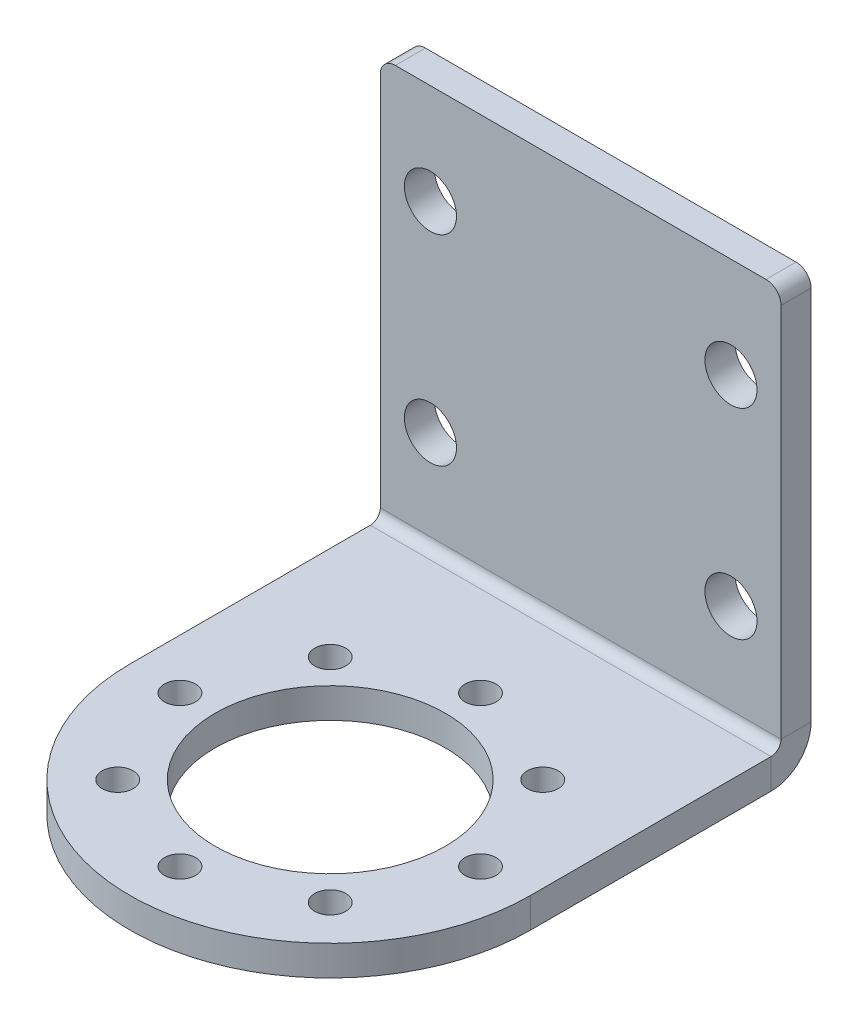
ISO-10303-21;
HEADER;
FILE_DESCRIPTION(('STEP AP214'),'2;1');
FILE_NAME('part.step','',(''),(''),'','','');
FILE_SCHEMA(('AUTOMOTIVE_DESIGN { 1 0 10303 214 1 1 1 1 }'));
ENDSEC;
DATA;
#1=APPLICATION_CONTEXT('core data for automotive mechanical design processes');
#2=APPLICATION_PROTOCOL_DEFINITION('international standard','automotive_design',2000,#1);
#3=PRODUCT_CONTEXT('',#1,'mechanical');
#4=PRODUCT('Part','Part','',(#3));
#5=PRODUCT_RELATED_PRODUCT_CATEGORY('part','',(#4));
#6=PRODUCT_DEFINITION_FORMATION('','',#4);
#7=PRODUCT_DEFINITION_CONTEXT('part definition',#1,'design');
#8=PRODUCT_DEFINITION('design','',#6,#7);
#9=PRODUCT_DEFINITION_SHAPE('','',#8);
#10=(LENGTH_UNIT() NAMED_UNIT(*) SI_UNIT(.MILLI.,.METRE.));
#11=(NAMED_UNIT(*) PLANE_ANGLE_UNIT() SI_UNIT($,.RADIAN.));
#12=(NAMED_UNIT(*) SI_UNIT($,.STERADIAN.) SOLID_ANGLE_UNIT());
#13=UNCERTAINTY_MEASURE_WITH_UNIT(LENGTH_MEASURE(1.E-05),#10,'distance_accuracy_value','');
#14=(GEOMETRIC_REPRESENTATION_CONTEXT(3) GLOBAL_UNCERTAINTY_ASSIGNED_CONTEXT((#13)) GLOBAL_UNIT_ASSIGNED_CONTEXT((#10,
#11,#12)) REPRESENTATION_CONTEXT('',''));
#15=CARTESIAN_POINT('',(0.,0.,0.));
#16=DIRECTION('',(0.,0.,1.));
#17=DIRECTION('',(1.,0.,0.));
#18=AXIS2_PLACEMENT_3D('',#15,#16,#17);
#19=CARTESIAN_POINT('',(-18.5,17.5,0.));
#20=DIRECTION('',(0.,0.,1.));
#21=DIRECTION('',(-0.999999999999933,-3.65500994803371E-07,0.));
#22=AXIS2_PLACEMENT_3D('',#19,#20,#21);
#23=CYLINDRICAL_SURFACE('',#22,1.5);
#24=CARTESIAN_POINT('',(-18.5,17.5,0.));
#25=DIRECTION('',(0.,0.,-1.));
#26=DIRECTION('',(-1.,0.,0.));
#27=AXIS2_PLACEMENT_3D('',#24,#25,#26);
#28=CIRCLE('',#27,1.5);
#29=CARTESIAN_POINT('',(-20.,17.5,0.));
#30=VERTEX_POINT('',#29);
#31=CARTESIAN_POINT('',(-18.5,19.,0.));
#32=VERTEX_POINT('',#31);
#33=EDGE_CURVE('E294',#30,#32,#28,.T.);
#34=ORIENTED_EDGE('',*,*,#33,.F.);
#35=DIRECTION('',(0.,0.,-1.));
#36=VECTOR('',#35,1.);
#37=CARTESIAN_POINT('',(-20.,17.5,3.));
#38=LINE('',#37,#36);
#39=CARTESIAN_POINT('',(-20.,17.5,3.));
#40=VERTEX_POINT('',#39);
#41=EDGE_CURVE('E281',#40,#30,#38,.T.);
#42=ORIENTED_EDGE('',*,*,#41,.F.);
#43=CARTESIAN_POINT('',(-18.5,17.5,3.));
#44=DIRECTION('',(0.,0.,1.));
#45=DIRECTION('',(0.,1.,0.));
#46=AXIS2_PLACEMENT_3D('',#43,#44,#45);
#47=CIRCLE('',#46,1.5);
#48=CARTESIAN_POINT('',(-18.5,19.,3.));
#49=VERTEX_POINT('',#48);
#50=EDGE_CURVE('E318',#49,#40,#47,.T.);
#51=ORIENTED_EDGE('',*,*,#50,.F.);
#52=DIRECTION('',(0.,0.,1.));
#53=VECTOR('',#52,1.);
#54=CARTESIAN_POINT('',(-18.5,19.,0.));
#55=LINE('',#54,#53);
#56=EDGE_CURVE('E312',#32,#49,#55,.T.);
#57=ORIENTED_EDGE('',*,*,#56,.F.);
#58=EDGE_LOOP('',(#34,#42,#51,#57));
#59=FACE_BOUND('',#58,.T.);
#60=ADVANCED_FACE('F17',(#59),#23,.T.);
#61=CARTESIAN_POINT('',(18.5,17.5,0.));
#62=DIRECTION('',(0.,0.,1.));
#63=DIRECTION('',(-3.65500990066421E-07,0.999999999999933,0.));
#64=AXIS2_PLACEMENT_3D('',#61,#62,#63);
#65=CYLINDRICAL_SURFACE('',#64,1.5);
#66=CARTESIAN_POINT('',(18.5,17.5,0.));
#67=DIRECTION('',(0.,0.,-1.));
#68=DIRECTION('',(0.,1.,0.));
#69=AXIS2_PLACEMENT_3D('',#66,#67,#68);
#70=CIRCLE('',#69,1.5);
#71=CARTESIAN_POINT('',(18.5,19.,0.));
#72=VERTEX_POINT('',#71);
#73=CARTESIAN_POINT('',(20.,17.5,0.));
#74=VERTEX_POINT('',#73);
#75=EDGE_CURVE('E266',#72,#74,#70,.T.);
#76=ORIENTED_EDGE('',*,*,#75,.F.);
#77=DIRECTION('',(0.,0.,-1.));
#78=VECTOR('',#77,1.);
#79=CARTESIAN_POINT('',(18.5,19.,3.));
#80=LINE('',#79,#78);
#81=CARTESIAN_POINT('',(18.5,19.,3.));
#82=VERTEX_POINT('',#81);
#83=EDGE_CURVE('E304',#82,#72,#80,.T.);
#84=ORIENTED_EDGE('',*,*,#83,.F.);
#85=CARTESIAN_POINT('',(18.5,17.5,3.));
#86=DIRECTION('',(0.,0.,1.));
#87=DIRECTION('',(1.,0.,0.));
#88=AXIS2_PLACEMENT_3D('',#85,#86,#87);
#89=CIRCLE('',#88,1.5);
#90=CARTESIAN_POINT('',(20.,17.5,3.));
#91=VERTEX_POINT('',#90);
#92=EDGE_CURVE('E432',#91,#82,#89,.T.);
#93=ORIENTED_EDGE('',*,*,#92,.F.);
#94=DIRECTION('',(0.,0.,1.));
#95=VECTOR('',#94,1.);
#96=CARTESIAN_POINT('',(20.,17.5,0.));
#97=LINE('',#96,#95);
#98=EDGE_CURVE('E269',#74,#91,#97,.T.);
#99=ORIENTED_EDGE('',*,*,#98,.F.);
#100=EDGE_LOOP('',(#76,#84,#93,#99));
#101=FACE_BOUND('',#100,.T.);
#102=ADVANCED_FACE('F19',(#101),#65,.T.);
#103=CARTESIAN_POINT('',(15.,9.,3.));
#104=DIRECTION('',(0.,0.,-1.));
#105=DIRECTION('',(-1.,0.,0.));
#106=AXIS2_PLACEMENT_3D('',#103,#104,#105);
#107=CYLINDRICAL_SURFACE('',#106,2.6);
#108=CARTESIAN_POINT('',(15.,9.,3.));
#109=DIRECTION('',(0.,0.,-1.));
#110=DIRECTION('',(-1.,0.,0.));
#111=AXIS2_PLACEMENT_3D('',#108,#109,#110);
#112=CIRCLE('',#111,2.6);
#113=CARTESIAN_POINT('',(17.6,9.,3.));
#114=VERTEX_POINT('',#113);
#115=EDGE_CURVE('E457',#114,#114,#112,.T.);
#116=ORIENTED_EDGE('',*,*,#115,.F.);
#117=DIRECTION('',(0.,0.,-1.));
#118=VECTOR('',#117,1.);
#119=CARTESIAN_POINT('',(17.6,9.,3.));
#120=LINE('',#119,#118);
#121=CARTESIAN_POINT('',(17.6,9.,0.));
#122=VERTEX_POINT('',#121);
#123=EDGE_CURVE('E11',#114,#122,#120,.T.);
#124=ORIENTED_EDGE('',*,*,#123,.T.);
#125=CARTESIAN_POINT('',(15.,9.,0.));
#126=DIRECTION('',(0.,0.,1.));
#127=DIRECTION('',(-1.,0.,0.));
#128=AXIS2_PLACEMENT_3D('',#125,#126,#127);
#129=CIRCLE('',#128,2.6);
#130=EDGE_CURVE('E428',#122,#122,#129,.T.);
#131=ORIENTED_EDGE('',*,*,#130,.F.);
#132=ORIENTED_EDGE('',*,*,#123,.F.);
#133=EDGE_LOOP('',(#116,#124,#131,#132));
#134=FACE_BOUND('',#133,.T.);
#135=ADVANCED_FACE('F528',(#134),#107,.F.);
#136=CARTESIAN_POINT('',(15.,-11.,3.));
#137=DIRECTION('',(0.,0.,-1.));
#138=DIRECTION('',(-1.,0.,0.));
#139=AXIS2_PLACEMENT_3D('',#136,#137,#138);
#140=CYLINDRICAL_SURFACE('',#139,2.6);
#141=CARTESIAN_POINT('',(15.,-11.,3.));
#142=DIRECTION('',(0.,0.,-1.));
#143=DIRECTION('',(-1.,0.,0.));
#144=AXIS2_PLACEMENT_3D('',#141,#142,#143);
#145=CIRCLE('',#144,2.6);
#146=CARTESIAN_POINT('',(17.6,-11.,3.));
#147=VERTEX_POINT('',#146);
#148=EDGE_CURVE('E454',#147,#147,#145,.T.);
#149=ORIENTED_EDGE('',*,*,#148,.F.);
#150=DIRECTION('',(0.,0.,-1.));
#151=VECTOR('',#150,1.);
#152=CARTESIAN_POINT('',(17.6,-11.,3.));
#153=LINE('',#152,#151);
#154=CARTESIAN_POINT('',(17.6,-11.,0.));
#155=VERTEX_POINT('',#154);
#156=EDGE_CURVE('E27',#147,#155,#153,.T.);
#157=ORIENTED_EDGE('',*,*,#156,.T.);
#158=CARTESIAN_POINT('',(15.,-11.,0.));
#159=DIRECTION('',(0.,0.,1.));
#160=DIRECTION('',(-1.,0.,0.));
#161=AXIS2_PLACEMENT_3D('',#158,#159,#160);
#162=CIRCLE('',#161,2.6);
#163=EDGE_CURVE('E433',#155,#155,#162,.T.);
#164=ORIENTED_EDGE('',*,*,#163,.F.);
#165=ORIENTED_EDGE('',*,*,#156,.F.);
#166=EDGE_LOOP('',(#149,#157,#164,#165));
#167=FACE_BOUND('',#166,.T.);
#168=ADVANCED_FACE('F907',(#167),#140,.F.);
#169=CARTESIAN_POINT('',(-15.,-11.,3.));
#170=DIRECTION('',(0.,0.,-1.));
#171=DIRECTION('',(-1.,0.,0.));
#172=AXIS2_PLACEMENT_3D('',#169,#170,#171);
#173=CYLINDRICAL_SURFACE('',#172,2.6);
#174=CARTESIAN_POINT('',(-15.,-11.,3.));
#175=DIRECTION('',(0.,0.,-1.));
#176=DIRECTION('',(-1.,0.,0.));
#177=AXIS2_PLACEMENT_3D('',#174,#175,#176);
#178=CIRCLE('',#177,2.6);
#179=CARTESIAN_POINT('',(-12.4,-11.,3.));
#180=VERTEX_POINT('',#179);
#181=EDGE_CURVE('E317',#180,#180,#178,.T.);
#182=ORIENTED_EDGE('',*,*,#181,.F.);
#183=DIRECTION('',(0.,0.,-1.));
#184=VECTOR('',#183,1.);
#185=CARTESIAN_POINT('',(-12.4,-11.,3.));
#186=LINE('',#185,#184);
#187=CARTESIAN_POINT('',(-12.4,-11.,0.));
#188=VERTEX_POINT('',#187);
#189=EDGE_CURVE('E356',#180,#188,#186,.T.);
#190=ORIENTED_EDGE('',*,*,#189,.T.);
#191=CARTESIAN_POINT('',(-15.,-11.,0.));
#192=DIRECTION('',(0.,0.,1.));
#193=DIRECTION('',(-1.,0.,0.));
#194=AXIS2_PLACEMENT_3D('',#191,#192,#193);
#195=CIRCLE('',#194,2.6);
#196=EDGE_CURVE('E291',#188,#188,#195,.T.);
#197=ORIENTED_EDGE('',*,*,#196,.F.);
#198=ORIENTED_EDGE('',*,*,#189,.F.);
#199=EDGE_LOOP('',(#182,#190,#197,#198));
#200=FACE_BOUND('',#199,.T.);
#201=ADVANCED_FACE('F899',(#200),#173,.F.);
#202=CARTESIAN_POINT('',(-15.,9.,3.));
#203=DIRECTION('',(0.,0.,-1.));
#204=DIRECTION('',(-1.,0.,0.));
#205=AXIS2_PLACEMENT_3D('',#202,#203,#204);
#206=CYLINDRICAL_SURFACE('',#205,2.6);
#207=CARTESIAN_POINT('',(-15.,9.,3.));
#208=DIRECTION('',(0.,0.,-1.));
#209=DIRECTION('',(-1.,0.,0.));
#210=AXIS2_PLACEMENT_3D('',#207,#208,#209);
#211=CIRCLE('',#210,2.6);
#212=CARTESIAN_POINT('',(-12.4,9.,3.));
#213=VERTEX_POINT('',#212);
#214=EDGE_CURVE('E313',#213,#213,#211,.T.);
#215=ORIENTED_EDGE('',*,*,#214,.F.);
#216=DIRECTION('',(0.,0.,-1.));
#217=VECTOR('',#216,1.);
#218=CARTESIAN_POINT('',(-12.4,9.,3.));
#219=LINE('',#218,#217);
#220=CARTESIAN_POINT('',(-12.4,9.,0.));
#221=VERTEX_POINT('',#220);
#222=EDGE_CURVE('E21',#213,#221,#219,.T.);
#223=ORIENTED_EDGE('',*,*,#222,.T.);
#224=CARTESIAN_POINT('',(-15.,9.,0.));
#225=DIRECTION('',(0.,0.,1.));
#226=DIRECTION('',(-1.,0.,0.));
#227=AXIS2_PLACEMENT_3D('',#224,#225,#226);
#228=CIRCLE('',#227,2.6);
#229=EDGE_CURVE('E287',#221,#221,#228,.T.);
#230=ORIENTED_EDGE('',*,*,#229,.F.);
#231=ORIENTED_EDGE('',*,*,#222,.F.);
#232=EDGE_LOOP('',(#215,#223,#230,#231));
#233=FACE_BOUND('',#232,.T.);
#234=ADVANCED_FACE('F507',(#233),#206,.F.);
#235=CARTESIAN_POINT('',(0.,0.,3.));
#236=DIRECTION('',(0.,0.,1.));
#237=DIRECTION('',(1.,0.,0.));
#238=AXIS2_PLACEMENT_3D('',#235,#236,#237);
#239=PLANE('',#238);
#240=ORIENTED_EDGE('',*,*,#115,.T.);
#241=EDGE_LOOP('',(#240));
#242=FACE_BOUND('',#241,.T.);
#243=ORIENTED_EDGE('',*,*,#148,.T.);
#244=EDGE_LOOP('',(#243));
#245=FACE_BOUND('',#244,.T.);
#246=ORIENTED_EDGE('',*,*,#181,.T.);
#247=EDGE_LOOP('',(#246));
#248=FACE_BOUND('',#247,.T.);
#249=ORIENTED_EDGE('',*,*,#214,.T.);
#250=EDGE_LOOP('',(#249));
#251=FACE_BOUND('',#250,.T.);
#252=DIRECTION('',(-1.,0.,0.));
#253=VECTOR('',#252,1.);
#254=CARTESIAN_POINT('',(20.,-20.,3.));
#255=LINE('',#254,#253);
#256=CARTESIAN_POINT('',(20.,-20.,3.));
#257=VERTEX_POINT('',#256);
#258=CARTESIAN_POINT('',(-20.,-20.,3.));
#259=VERTEX_POINT('',#258);
#260=EDGE_CURVE('E366',#257,#259,#255,.T.);
#261=ORIENTED_EDGE('',*,*,#260,.F.);
#262=DIRECTION('',(0.,-1.,0.));
#263=VECTOR('',#262,1.);
#264=CARTESIAN_POINT('',(20.,17.5,3.));
#265=LINE('',#264,#263);
#266=EDGE_CURVE('E260',#91,#257,#265,.T.);
#267=ORIENTED_EDGE('',*,*,#266,.F.);
#268=ORIENTED_EDGE('',*,*,#92,.T.);
#269=DIRECTION('',(1.,0.,0.));
#270=VECTOR('',#269,1.);
#271=CARTESIAN_POINT('',(-18.5,19.,3.));
#272=LINE('',#271,#270);
#273=EDGE_CURVE('E308',#49,#82,#272,.T.);
#274=ORIENTED_EDGE('',*,*,#273,.F.);
#275=ORIENTED_EDGE('',*,*,#50,.T.);
#276=DIRECTION('',(0.,1.,0.));
#277=VECTOR('',#276,1.);
#278=CARTESIAN_POINT('',(-20.,-20.,3.));
#279=LINE('',#278,#277);
#280=EDGE_CURVE('E286',#259,#40,#279,.T.);
#281=ORIENTED_EDGE('',*,*,#280,.F.);
#282=EDGE_LOOP('',(#261,#267,#268,#274,#275,#281));
#283=FACE_BOUND('',#282,.T.);
#284=ADVANCED_FACE('F511',(#242,#245,#248,#251,#283),#239,.T.);
#285=CARTESIAN_POINT('',(0.,0.,0.));
#286=DIRECTION('',(0.,0.,-1.));
#287=DIRECTION('',(0.,-1.,0.));
#288=AXIS2_PLACEMENT_3D('',#285,#286,#287);
#289=PLANE('',#288);
#290=ORIENTED_EDGE('',*,*,#130,.T.);
#291=EDGE_LOOP('',(#290));
#292=FACE_BOUND('',#291,.T.);
#293=ORIENTED_EDGE('',*,*,#163,.T.);
#294=EDGE_LOOP('',(#293));
#295=FACE_BOUND('',#294,.T.);
#296=ORIENTED_EDGE('',*,*,#196,.T.);
#297=EDGE_LOOP('',(#296));
#298=FACE_BOUND('',#297,.T.);
#299=ORIENTED_EDGE('',*,*,#229,.T.);
#300=EDGE_LOOP('',(#299));
#301=FACE_BOUND('',#300,.T.);
#302=DIRECTION('',(0.,-1.,0.));
#303=VECTOR('',#302,1.);
#304=CARTESIAN_POINT('',(-20.,17.5,0.));
#305=LINE('',#304,#303);
#306=CARTESIAN_POINT('',(-20.,-20.,0.));
#307=VERTEX_POINT('',#306);
#308=EDGE_CURVE('E285',#30,#307,#305,.T.);
#309=ORIENTED_EDGE('',*,*,#308,.F.);
#310=ORIENTED_EDGE('',*,*,#33,.T.);
#311=DIRECTION('',(-1.,0.,0.));
#312=VECTOR('',#311,1.);
#313=CARTESIAN_POINT('',(18.5,19.,0.));
#314=LINE('',#313,#312);
#315=EDGE_CURVE('E262',#72,#32,#314,.T.);
#316=ORIENTED_EDGE('',*,*,#315,.F.);
#317=ORIENTED_EDGE('',*,*,#75,.T.);
#318=DIRECTION('',(0.,1.,0.));
#319=VECTOR('',#318,1.);
#320=CARTESIAN_POINT('',(20.,-20.,0.));
#321=LINE('',#320,#319);
#322=CARTESIAN_POINT('',(20.,-20.,0.));
#323=VERTEX_POINT('',#322);
#324=EDGE_CURVE('E258',#323,#74,#321,.T.);
#325=ORIENTED_EDGE('',*,*,#324,.F.);
#326=DIRECTION('',(1.,0.,0.));
#327=VECTOR('',#326,1.);
#328=CARTESIAN_POINT('',(-20.,-20.,0.));
#329=LINE('',#328,#327);
#330=EDGE_CURVE('E241',#307,#323,#329,.T.);
#331=ORIENTED_EDGE('',*,*,#330,.F.);
#332=EDGE_LOOP('',(#309,#310,#316,#317,#325,#331));
#333=FACE_BOUND('',#332,.T.);
#334=ADVANCED_FACE('F264',(#292,#295,#298,#301,#333),#289,.T.);
#335=CARTESIAN_POINT('',(15.,-21.,28.));
#336=DIRECTION('',(0.,-1.,0.));
#337=DIRECTION('',(-1.,0.,0.));
#338=AXIS2_PLACEMENT_3D('',#335,#336,#337);
#339=CYLINDRICAL_SURFACE('',#338,1.55);
#340=CARTESIAN_POINT('',(15.,-21.,28.));
#341=DIRECTION('',(0.,-1.,0.));
#342=DIRECTION('',(-1.,0.,0.));
#343=AXIS2_PLACEMENT_3D('',#340,#341,#342);
#344=CIRCLE('',#343,1.55);
#345=CARTESIAN_POINT('',(16.55,-21.,28.));
#346=VERTEX_POINT('',#345);
#347=EDGE_CURVE('E347',#346,#346,#344,.T.);
#348=ORIENTED_EDGE('',*,*,#347,.F.);
#349=DIRECTION('',(0.,-1.,0.));
#350=VECTOR('',#349,1.);
#351=CARTESIAN_POINT('',(16.55,-21.,28.));
#352=LINE('',#351,#350);
#353=CARTESIAN_POINT('',(16.55,-24.,28.));
#354=VERTEX_POINT('',#353);
#355=EDGE_CURVE('E370',#346,#354,#352,.T.);
#356=ORIENTED_EDGE('',*,*,#355,.T.);
#357=CARTESIAN_POINT('',(15.,-24.,28.));
#358=DIRECTION('',(0.,1.,0.));
#359=DIRECTION('',(-1.,0.,0.));
#360=AXIS2_PLACEMENT_3D('',#357,#358,#359);
#361=CIRCLE('',#360,1.55);
#362=EDGE_CURVE('E421',#354,#354,#361,.T.);
#363=ORIENTED_EDGE('',*,*,#362,.F.);
#364=ORIENTED_EDGE('',*,*,#355,.F.);
#365=EDGE_LOOP('',(#348,#356,#363,#364));
#366=FACE_BOUND('',#365,.T.);
#367=ADVANCED_FACE('F510',(#366),#339,.F.);
#368=CARTESIAN_POINT('',(0.,-21.,13.));
#369=DIRECTION('',(0.,-1.,0.));
#370=DIRECTION('',(-1.,0.,0.));
#371=AXIS2_PLACEMENT_3D('',#368,#369,#370);
#372=CYLINDRICAL_SURFACE('',#371,1.55);
#373=CARTESIAN_POINT('',(0.,-21.,13.));
#374=DIRECTION('',(0.,-1.,0.));
#375=DIRECTION('',(-1.,0.,0.));
#376=AXIS2_PLACEMENT_3D('',#373,#374,#375);
#377=CIRCLE('',#376,1.55);
#378=CARTESIAN_POINT('',(1.55000000000006,-21.,13.));
#379=VERTEX_POINT('',#378);
#380=EDGE_CURVE('E393',#379,#379,#377,.T.);
#381=ORIENTED_EDGE('',*,*,#380,.F.);
#382=DIRECTION('',(0.,-1.,0.));
#383=VECTOR('',#382,1.);
#384=CARTESIAN_POINT('',(1.55000000000006,-21.,13.));
#385=LINE('',#384,#383);
#386=CARTESIAN_POINT('',(1.55000000000006,-24.,13.));
#387=VERTEX_POINT('',#386);
#388=EDGE_CURVE('E367',#379,#387,#385,.T.);
#389=ORIENTED_EDGE('',*,*,#388,.T.);
#390=CARTESIAN_POINT('',(0.,-24.,13.));
#391=DIRECTION('',(0.,1.,0.));
#392=DIRECTION('',(-1.,0.,0.));
#393=AXIS2_PLACEMENT_3D('',#390,#391,#392);
#394=CIRCLE('',#393,1.55);
#395=EDGE_CURVE('E385',#387,#387,#394,.T.);
#396=ORIENTED_EDGE('',*,*,#395,.F.);
#397=ORIENTED_EDGE('',*,*,#388,.F.);
#398=EDGE_LOOP('',(#381,#389,#396,#397));
#399=FACE_BOUND('',#398,.T.);
#400=ADVANCED_FACE('F518',(#399),#372,.F.);
#401=CARTESIAN_POINT('',(10.606601717798,-21.,17.393398282202));
#402=DIRECTION('',(0.,-1.,0.));
#403=DIRECTION('',(-1.,0.,0.));
#404=AXIS2_PLACEMENT_3D('',#401,#402,#403);
#405=CYLINDRICAL_SURFACE('',#404,1.55);
#406=CARTESIAN_POINT('',(10.606601717798,-21.,17.393398282202));
#407=DIRECTION('',(0.,-1.,0.));
#408=DIRECTION('',(-1.,0.,0.));
#409=AXIS2_PLACEMENT_3D('',#406,#407,#408);
#410=CIRCLE('',#409,1.5499999999997);
#411=CARTESIAN_POINT('',(12.156601717798,-21.,17.393398282202));
#412=VERTEX_POINT('',#411);
#413=EDGE_CURVE('E388',#412,#412,#410,.T.);
#414=ORIENTED_EDGE('',*,*,#413,.F.);
#415=DIRECTION('',(0.,-1.,0.));
#416=VECTOR('',#415,1.);
#417=CARTESIAN_POINT('',(12.156601717798,-21.,17.393398282202));
#418=LINE('',#417,#416);
#419=CARTESIAN_POINT('',(12.156601717798,-24.,17.393398282202));
#420=VERTEX_POINT('',#419);
#421=EDGE_CURVE('E371',#412,#420,#418,.T.);
#422=ORIENTED_EDGE('',*,*,#421,.T.);
#423=CARTESIAN_POINT('',(10.606601717798,-24.,17.393398282202));
#424=DIRECTION('',(0.,1.,0.));
#425=DIRECTION('',(-1.,0.,0.));
#426=AXIS2_PLACEMENT_3D('',#423,#424,#425);
#427=CIRCLE('',#426,1.5499999999997);
#428=EDGE_CURVE('E380',#420,#420,#427,.T.);
#429=ORIENTED_EDGE('',*,*,#428,.F.);
#430=ORIENTED_EDGE('',*,*,#421,.F.);
#431=EDGE_LOOP('',(#414,#422,#429,#430));
#432=FACE_BOUND('',#431,.T.);
#433=ADVANCED_FACE('F553',(#432),#405,.F.);
#434=CARTESIAN_POINT('',(10.606601717798,-21.,38.606601717798));
#435=DIRECTION('',(0.,-1.,0.));
#436=DIRECTION('',(-1.,0.,0.));
#437=AXIS2_PLACEMENT_3D('',#434,#435,#436);
#438=CYLINDRICAL_SURFACE('',#437,1.55);
#439=CARTESIAN_POINT('',(10.606601717798,-21.,38.606601717798));
#440=DIRECTION('',(0.,-1.,0.));
#441=DIRECTION('',(-1.,0.,0.));
#442=AXIS2_PLACEMENT_3D('',#439,#440,#441);
#443=CIRCLE('',#442,1.5499999999997);
#444=CARTESIAN_POINT('',(12.156601717798,-21.,38.606601717798));
#445=VERTEX_POINT('',#444);
#446=EDGE_CURVE('E392',#445,#445,#443,.T.);
#447=ORIENTED_EDGE('',*,*,#446,.F.);
#448=DIRECTION('',(0.,-1.,0.));
#449=VECTOR('',#448,1.);
#450=CARTESIAN_POINT('',(12.156601717798,-21.,38.606601717798));
#451=LINE('',#450,#449);
#452=CARTESIAN_POINT('',(12.156601717798,-24.,38.606601717798));
#453=VERTEX_POINT('',#452);
#454=EDGE_CURVE('E480',#445,#453,#451,.T.);
#455=ORIENTED_EDGE('',*,*,#454,.T.);
#456=CARTESIAN_POINT('',(10.606601717798,-24.,38.606601717798));
#457=DIRECTION('',(0.,1.,0.));
#458=DIRECTION('',(-1.,0.,0.));
#459=AXIS2_PLACEMENT_3D('',#456,#457,#458);
#460=CIRCLE('',#459,1.5499999999997);
#461=EDGE_CURVE('E384',#453,#453,#460,.T.);
#462=ORIENTED_EDGE('',*,*,#461,.F.);
#463=ORIENTED_EDGE('',*,*,#454,.F.);
#464=EDGE_LOOP('',(#447,#455,#462,#463));
#465=FACE_BOUND('',#464,.T.);
#466=ADVANCED_FACE('F563',(#465),#438,.F.);
#467=CARTESIAN_POINT('',(0.,-21.,43.));
#468=DIRECTION('',(0.,-1.,0.));
#469=DIRECTION('',(-1.,0.,0.));
#470=AXIS2_PLACEMENT_3D('',#467,#468,#469);
#471=CYLINDRICAL_SURFACE('',#470,1.55);
#472=CARTESIAN_POINT('',(0.,-21.,43.));
#473=DIRECTION('',(0.,-1.,0.));
#474=DIRECTION('',(-1.,0.,0.));
#475=AXIS2_PLACEMENT_3D('',#472,#473,#474);
#476=CIRCLE('',#475,1.55);
#477=CARTESIAN_POINT('',(1.55000000000003,-21.,43.));
#478=VERTEX_POINT('',#477);
#479=EDGE_CURVE('E406',#478,#478,#476,.T.);
#480=ORIENTED_EDGE('',*,*,#479,.F.);
#481=DIRECTION('',(0.,-1.,0.));
#482=VECTOR('',#481,1.);
#483=CARTESIAN_POINT('',(1.55000000000003,-21.,43.));
#484=LINE('',#483,#482);
#485=CARTESIAN_POINT('',(1.55000000000003,-24.,43.));
#486=VERTEX_POINT('',#485);
#487=EDGE_CURVE('E477',#478,#486,#484,.T.);
#488=ORIENTED_EDGE('',*,*,#487,.T.);
#489=CARTESIAN_POINT('',(0.,-24.,43.));
#490=DIRECTION('',(0.,1.,0.));
#491=DIRECTION('',(-1.,0.,0.));
#492=AXIS2_PLACEMENT_3D('',#489,#490,#491);
#493=CIRCLE('',#492,1.5500000000001);
#494=EDGE_CURVE('E411',#486,#486,#493,.T.);
#495=ORIENTED_EDGE('',*,*,#494,.F.);
#496=ORIENTED_EDGE('',*,*,#487,.F.);
#497=EDGE_LOOP('',(#480,#488,#495,#496));
#498=FACE_BOUND('',#497,.T.);
#499=ADVANCED_FACE('F559',(#498),#471,.F.);
#500=CARTESIAN_POINT('',(-10.606601717798,-21.,17.393398282202));
#501=DIRECTION('',(0.,-1.,0.));
#502=DIRECTION('',(-1.,0.,0.));
#503=AXIS2_PLACEMENT_3D('',#500,#501,#502);
#504=CYLINDRICAL_SURFACE('',#503,1.55);
#505=CARTESIAN_POINT('',(-10.606601717798,-21.,17.393398282202));
#506=DIRECTION('',(0.,-1.,0.));
#507=DIRECTION('',(-1.,0.,0.));
#508=AXIS2_PLACEMENT_3D('',#505,#506,#507);
#509=CIRCLE('',#508,1.55);
#510=CARTESIAN_POINT('',(-9.056601717798,-21.,17.393398282202));
#511=VERTEX_POINT('',#510);
#512=EDGE_CURVE('E450',#511,#511,#509,.T.);
#513=ORIENTED_EDGE('',*,*,#512,.F.);
#514=DIRECTION('',(0.,-1.,0.));
#515=VECTOR('',#514,1.);
#516=CARTESIAN_POINT('',(-9.056601717798,-21.,17.393398282202));
#517=LINE('',#516,#515);
#518=CARTESIAN_POINT('',(-9.056601717798,-24.,17.393398282202));
#519=VERTEX_POINT('',#518);
#520=EDGE_CURVE('E301',#511,#519,#517,.T.);
#521=ORIENTED_EDGE('',*,*,#520,.T.);
#522=CARTESIAN_POINT('',(-10.606601717798,-24.,17.393398282202));
#523=DIRECTION('',(0.,1.,0.));
#524=DIRECTION('',(-1.,0.,0.));
#525=AXIS2_PLACEMENT_3D('',#522,#523,#524);
#526=CIRCLE('',#525,1.55);
#527=EDGE_CURVE('E415',#519,#519,#526,.T.);
#528=ORIENTED_EDGE('',*,*,#527,.F.);
#529=ORIENTED_EDGE('',*,*,#520,.F.);
#530=EDGE_LOOP('',(#513,#521,#528,#529));
#531=FACE_BOUND('',#530,.T.);
#532=ADVANCED_FACE('F562',(#531),#504,.F.);
#533=CARTESIAN_POINT('',(-10.606601717798,-21.,38.606601717798));
#534=DIRECTION('',(0.,-1.,0.));
#535=DIRECTION('',(-1.,0.,0.));
#536=AXIS2_PLACEMENT_3D('',#533,#534,#535);
#537=CYLINDRICAL_SURFACE('',#536,1.55);
#538=CARTESIAN_POINT('',(-10.606601717798,-21.,38.606601717798));
#539=DIRECTION('',(0.,-1.,0.));
#540=DIRECTION('',(-1.,0.,0.));
#541=AXIS2_PLACEMENT_3D('',#538,#539,#540);
#542=CIRCLE('',#541,1.55);
#543=CARTESIAN_POINT('',(-9.056601717798,-21.,38.606601717798));
#544=VERTEX_POINT('',#543);
#545=EDGE_CURVE('E446',#544,#544,#542,.T.);
#546=ORIENTED_EDGE('',*,*,#545,.F.);
#547=DIRECTION('',(0.,-1.,0.));
#548=VECTOR('',#547,1.);
#549=CARTESIAN_POINT('',(-9.056601717798,-21.,38.606601717798));
#550=LINE('',#549,#548);
#551=CARTESIAN_POINT('',(-9.056601717798,-24.,38.606601717798));
#552=VERTEX_POINT('',#551);
#553=EDGE_CURVE('E299',#544,#552,#550,.T.);
#554=ORIENTED_EDGE('',*,*,#553,.T.);
#555=CARTESIAN_POINT('',(-10.606601717798,-24.,38.606601717798));
#556=DIRECTION('',(0.,1.,0.));
#557=DIRECTION('',(-1.,0.,0.));
#558=AXIS2_PLACEMENT_3D('',#555,#556,#557);
#559=CIRCLE('',#558,1.55);
#560=EDGE_CURVE('E379',#552,#552,#559,.T.);
#561=ORIENTED_EDGE('',*,*,#560,.F.);
#562=ORIENTED_EDGE('',*,*,#553,.F.);
#563=EDGE_LOOP('',(#546,#554,#561,#562));
#564=FACE_BOUND('',#563,.T.);
#565=ADVANCED_FACE('F577',(#564),#537,.F.);
#566=CARTESIAN_POINT('',(0.,-21.,28.));
#567=DIRECTION('',(0.,-1.,0.));
#568=DIRECTION('',(-1.,0.,0.));
#569=AXIS2_PLACEMENT_3D('',#566,#567,#568);
#570=CYLINDRICAL_SURFACE('',#569,11.5);
#571=CARTESIAN_POINT('',(0.,-21.,28.));
#572=DIRECTION('',(0.,-1.,0.));
#573=DIRECTION('',(-1.,0.,0.));
#574=AXIS2_PLACEMENT_3D('',#571,#572,#573);
#575=CIRCLE('',#574,11.5);
#576=CARTESIAN_POINT('',(11.5,-21.,28.));
#577=VERTEX_POINT('',#576);
#578=EDGE_CURVE('E344',#577,#577,#575,.T.);
#579=ORIENTED_EDGE('',*,*,#578,.F.);
#580=DIRECTION('',(0.,-1.,0.));
#581=VECTOR('',#580,1.);
#582=CARTESIAN_POINT('',(11.5,-21.,28.));
#583=LINE('',#582,#581);
#584=CARTESIAN_POINT('',(11.5,-24.,28.));
#585=VERTEX_POINT('',#584);
#586=EDGE_CURVE('E302',#577,#585,#583,.T.);
#587=ORIENTED_EDGE('',*,*,#586,.T.);
#588=CARTESIAN_POINT('',(0.,-24.,28.));
#589=DIRECTION('',(0.,1.,0.));
#590=DIRECTION('',(-1.,0.,0.));
#591=AXIS2_PLACEMENT_3D('',#588,#589,#590);
#592=CIRCLE('',#591,11.5);
#593=EDGE_CURVE('E374',#585,#585,#592,.T.);
#594=ORIENTED_EDGE('',*,*,#593,.F.);
#595=ORIENTED_EDGE('',*,*,#586,.F.);
#596=EDGE_LOOP('',(#579,#587,#594,#595));
#597=FACE_BOUND('',#596,.T.);
#598=ADVANCED_FACE('F573',(#597),#570,.F.);
#599=CARTESIAN_POINT('',(-15.,-21.,28.));
#600=DIRECTION('',(0.,-1.,0.));
#601=DIRECTION('',(-1.,0.,0.));
#602=AXIS2_PLACEMENT_3D('',#599,#600,#601);
#603=CYLINDRICAL_SURFACE('',#602,1.55);
#604=CARTESIAN_POINT('',(-15.,-21.,28.));
#605=DIRECTION('',(0.,-1.,0.));
#606=DIRECTION('',(-1.,0.,0.));
#607=AXIS2_PLACEMENT_3D('',#604,#605,#606);
#608=CIRCLE('',#607,1.55);
#609=CARTESIAN_POINT('',(-13.45,-21.,28.));
#610=VERTEX_POINT('',#609);
#611=EDGE_CURVE('E348',#610,#610,#608,.T.);
#612=ORIENTED_EDGE('',*,*,#611,.F.);
#613=DIRECTION('',(0.,-1.,0.));
#614=VECTOR('',#613,1.);
#615=CARTESIAN_POINT('',(-13.45,-21.,28.));
#616=LINE('',#615,#614);
#617=CARTESIAN_POINT('',(-13.45,-24.,28.));
#618=VERTEX_POINT('',#617);
#619=EDGE_CURVE('E403',#610,#618,#616,.T.);
#620=ORIENTED_EDGE('',*,*,#619,.T.);
#621=CARTESIAN_POINT('',(-15.,-24.,28.));
#622=DIRECTION('',(0.,1.,0.));
#623=DIRECTION('',(-1.,0.,0.));
#624=AXIS2_PLACEMENT_3D('',#621,#622,#623);
#625=CIRCLE('',#624,1.55);
#626=EDGE_CURVE('E378',#618,#618,#625,.T.);
#627=ORIENTED_EDGE('',*,*,#626,.F.);
#628=ORIENTED_EDGE('',*,*,#619,.F.);
#629=EDGE_LOOP('',(#612,#620,#627,#628));
#630=FACE_BOUND('',#629,.T.);
#631=ADVANCED_FACE('F576',(#630),#603,.F.);
#632=CARTESIAN_POINT('',(0.,-21.,28.));
#633=DIRECTION('',(0.,-1.,0.));
#634=DIRECTION('',(-1.,0.,0.));
#635=AXIS2_PLACEMENT_3D('',#632,#633,#634);
#636=CYLINDRICAL_SURFACE('',#635,20.);
#637=DIRECTION('',(0.,-1.,0.));
#638=VECTOR('',#637,1.);
#639=CARTESIAN_POINT('',(20.,-21.,28.));
#640=LINE('',#639,#638);
#641=CARTESIAN_POINT('',(20.,-21.,28.));
#642=VERTEX_POINT('',#641);
#643=CARTESIAN_POINT('',(20.,-24.,28.));
#644=VERTEX_POINT('',#643);
#645=EDGE_CURVE('E402',#642,#644,#640,.T.);
#646=ORIENTED_EDGE('',*,*,#645,.F.);
#647=CARTESIAN_POINT('',(0.,-21.,28.));
#648=DIRECTION('',(0.,1.,0.));
#649=DIRECTION('',(-1.,0.,0.));
#650=AXIS2_PLACEMENT_3D('',#647,#648,#649);
#651=CIRCLE('',#650,20.);
#652=CARTESIAN_POINT('',(-20.,-21.,28.));
#653=VERTEX_POINT('',#652);
#654=EDGE_CURVE('E443',#653,#642,#651,.T.);
#655=ORIENTED_EDGE('',*,*,#654,.F.);
#656=DIRECTION('',(0.,1.,0.));
#657=VECTOR('',#656,1.);
#658=CARTESIAN_POINT('',(-20.,-24.,28.));
#659=LINE('',#658,#657);
#660=CARTESIAN_POINT('',(-20.,-24.,28.));
#661=VERTEX_POINT('',#660);
#662=EDGE_CURVE('E332',#661,#653,#659,.T.);
#663=ORIENTED_EDGE('',*,*,#662,.F.);
#664=CARTESIAN_POINT('',(0.,-24.,28.));
#665=DIRECTION('',(0.,-1.,0.));
#666=DIRECTION('',(1.,0.,0.));
#667=AXIS2_PLACEMENT_3D('',#664,#665,#666);
#668=CIRCLE('',#667,20.);
#669=EDGE_CURVE('E418',#644,#661,#668,.T.);
#670=ORIENTED_EDGE('',*,*,#669,.F.);
#671=EDGE_LOOP('',(#646,#655,#663,#670));
#672=FACE_BOUND('',#671,.T.);
#673=ADVANCED_FACE('F571',(#672),#636,.T.);
#674=CARTESIAN_POINT('',(0.,-21.,26.));
#675=DIRECTION('',(0.,1.,0.));
#676=DIRECTION('',(1.,0.,0.));
#677=AXIS2_PLACEMENT_3D('',#674,#675,#676);
#678=PLANE('',#677);
#679=ORIENTED_EDGE('',*,*,#479,.T.);
#680=EDGE_LOOP('',(#679));
#681=FACE_BOUND('',#680,.T.);
#682=ORIENTED_EDGE('',*,*,#446,.T.);
#683=EDGE_LOOP('',(#682));
#684=FACE_BOUND('',#683,.T.);
#685=ORIENTED_EDGE('',*,*,#413,.T.);
#686=EDGE_LOOP('',(#685));
#687=FACE_BOUND('',#686,.T.);
#688=ORIENTED_EDGE('',*,*,#380,.T.);
#689=EDGE_LOOP('',(#688));
#690=FACE_BOUND('',#689,.T.);
#691=ORIENTED_EDGE('',*,*,#347,.T.);
#692=EDGE_LOOP('',(#691));
#693=FACE_BOUND('',#692,.T.);
#694=ORIENTED_EDGE('',*,*,#578,.T.);
#695=EDGE_LOOP('',(#694));
#696=FACE_BOUND('',#695,.T.);
#697=ORIENTED_EDGE('',*,*,#611,.T.);
#698=EDGE_LOOP('',(#697));
#699=FACE_BOUND('',#698,.T.);
#700=ORIENTED_EDGE('',*,*,#512,.T.);
#701=EDGE_LOOP('',(#700));
#702=FACE_BOUND('',#701,.T.);
#703=ORIENTED_EDGE('',*,*,#545,.T.);
#704=EDGE_LOOP('',(#703));
#705=FACE_BOUND('',#704,.T.);
#706=DIRECTION('',(1.,0.,0.));
#707=VECTOR('',#706,1.);
#708=CARTESIAN_POINT('',(-20.,-21.,4.));
#709=LINE('',#708,#707);
#710=CARTESIAN_POINT('',(-20.,-21.,4.));
#711=VERTEX_POINT('',#710);
#712=CARTESIAN_POINT('',(20.,-21.,4.));
#713=VERTEX_POINT('',#712);
#714=EDGE_CURVE('E355',#711,#713,#709,.T.);
#715=ORIENTED_EDGE('',*,*,#714,.F.);
#716=DIRECTION('',(0.,0.,-1.));
#717=VECTOR('',#716,1.);
#718=CARTESIAN_POINT('',(-20.,-21.,28.));
#719=LINE('',#718,#717);
#720=EDGE_CURVE('E336',#653,#711,#719,.T.);
#721=ORIENTED_EDGE('',*,*,#720,.F.);
#722=ORIENTED_EDGE('',*,*,#654,.T.);
#723=DIRECTION('',(0.,0.,1.));
#724=VECTOR('',#723,1.);
#725=CARTESIAN_POINT('',(20.,-21.,4.));
#726=LINE('',#725,#724);
#727=EDGE_CURVE('E352',#713,#642,#726,.T.);
#728=ORIENTED_EDGE('',*,*,#727,.F.);
#729=EDGE_LOOP('',(#715,#721,#722,#728));
#730=FACE_BOUND('',#729,.T.);
#731=ADVANCED_FACE('F567',(#681,#684,#687,#690,#693,#696,#699,#702,#705,#730),#678,.T.);
#732=CARTESIAN_POINT('',(0.,-24.,26.));
#733=DIRECTION('',(0.,-1.,0.));
#734=DIRECTION('',(-1.,0.,0.));
#735=AXIS2_PLACEMENT_3D('',#732,#733,#734);
#736=PLANE('',#735);
#737=ORIENTED_EDGE('',*,*,#626,.T.);
#738=EDGE_LOOP('',(#737));
#739=FACE_BOUND('',#738,.T.);
#740=ORIENTED_EDGE('',*,*,#593,.T.);
#741=EDGE_LOOP('',(#740));
#742=FACE_BOUND('',#741,.T.);
#743=ORIENTED_EDGE('',*,*,#560,.T.);
#744=EDGE_LOOP('',(#743));
#745=FACE_BOUND('',#744,.T.);
#746=ORIENTED_EDGE('',*,*,#527,.T.);
#747=EDGE_LOOP('',(#746));
#748=FACE_BOUND('',#747,.T.);
#749=ORIENTED_EDGE('',*,*,#494,.T.);
#750=EDGE_LOOP('',(#749));
#751=FACE_BOUND('',#750,.T.);
#752=ORIENTED_EDGE('',*,*,#461,.T.);
#753=EDGE_LOOP('',(#752));
#754=FACE_BOUND('',#753,.T.);
#755=ORIENTED_EDGE('',*,*,#428,.T.);
#756=EDGE_LOOP('',(#755));
#757=FACE_BOUND('',#756,.T.);
#758=ORIENTED_EDGE('',*,*,#395,.T.);
#759=EDGE_LOOP('',(#758));
#760=FACE_BOUND('',#759,.T.);
#761=ORIENTED_EDGE('',*,*,#362,.T.);
#762=EDGE_LOOP('',(#761));
#763=FACE_BOUND('',#762,.T.);
#764=DIRECTION('',(-1.,0.,0.));
#765=VECTOR('',#764,1.);
#766=CARTESIAN_POINT('',(20.,-24.,4.));
#767=LINE('',#766,#765);
#768=CARTESIAN_POINT('',(20.,-24.,4.));
#769=VERTEX_POINT('',#768);
#770=CARTESIAN_POINT('',(-20.,-24.,4.));
#771=VERTEX_POINT('',#770);
#772=EDGE_CURVE('E240',#769,#771,#767,.T.);
#773=ORIENTED_EDGE('',*,*,#772,.F.);
#774=DIRECTION('',(0.,0.,-1.));
#775=VECTOR('',#774,1.);
#776=CARTESIAN_POINT('',(20.,-24.,28.));
#777=LINE('',#776,#775);
#778=EDGE_CURVE('E410',#644,#769,#777,.T.);
#779=ORIENTED_EDGE('',*,*,#778,.F.);
#780=ORIENTED_EDGE('',*,*,#669,.T.);
#781=DIRECTION('',(0.,0.,1.));
#782=VECTOR('',#781,1.);
#783=CARTESIAN_POINT('',(-20.,-24.,4.));
#784=LINE('',#783,#782);
#785=EDGE_CURVE('E337',#771,#661,#784,.T.);
#786=ORIENTED_EDGE('',*,*,#785,.F.);
#787=EDGE_LOOP('',(#773,#779,#780,#786));
#788=FACE_BOUND('',#787,.T.);
#789=ADVANCED_FACE('F557',(#739,#742,#745,#748,#751,#754,#757,#760,#763,#788),#736,.T.);
#790=CARTESIAN_POINT('',(20.,-2.,26.));
#791=DIRECTION('',(1.,0.,0.));
#792=DIRECTION('',(0.,1.,0.));
#793=AXIS2_PLACEMENT_3D('',#790,#791,#792);
#794=PLANE('',#793);
#795=ORIENTED_EDGE('',*,*,#727,.T.);
#796=ORIENTED_EDGE('',*,*,#645,.T.);
#797=ORIENTED_EDGE('',*,*,#778,.T.);
#798=DIRECTION('',(0.,-1.,0.));
#799=VECTOR('',#798,1.);
#800=CARTESIAN_POINT('',(20.,-21.,4.));
#801=LINE('',#800,#799);
#802=EDGE_CURVE('E235',#713,#769,#801,.T.);
#803=ORIENTED_EDGE('',*,*,#802,.F.);
#804=EDGE_LOOP('',(#795,#796,#797,#803));
#805=FACE_BOUND('',#804,.T.);
#806=ADVANCED_FACE('F549',(#805),#794,.T.);
#807=CARTESIAN_POINT('',(-20.,-2.,26.));
#808=DIRECTION('',(-1.,0.,0.));
#809=DIRECTION('',(0.,0.,1.));
#810=AXIS2_PLACEMENT_3D('',#807,#808,#809);
#811=PLANE('',#810);
#812=DIRECTION('',(0.,1.,0.));
#813=VECTOR('',#812,1.);
#814=CARTESIAN_POINT('',(-20.,-24.,4.));
#815=LINE('',#814,#813);
#816=EDGE_CURVE('E252',#771,#711,#815,.T.);
#817=ORIENTED_EDGE('',*,*,#816,.F.);
#818=ORIENTED_EDGE('',*,*,#785,.T.);
#819=ORIENTED_EDGE('',*,*,#662,.T.);
#820=ORIENTED_EDGE('',*,*,#720,.T.);
#821=EDGE_LOOP('',(#817,#818,#819,#820));
#822=FACE_BOUND('',#821,.T.);
#823=ADVANCED_FACE('F546',(#822),#811,.T.);
#824=CARTESIAN_POINT('',(20.,-24.2,2.));
#825=DIRECTION('',(1.,0.,0.));
#826=DIRECTION('',(0.,1.,0.));
#827=AXIS2_PLACEMENT_3D('',#824,#825,#826);
#828=PLANE('',#827);
#829=ORIENTED_EDGE('',*,*,#802,.T.);
#830=CARTESIAN_POINT('',(20.,-20.,4.));
#831=DIRECTION('',(-1.,0.,0.));
#832=DIRECTION('',(0.,0.,-1.));
#833=AXIS2_PLACEMENT_3D('',#830,#831,#832);
#834=CIRCLE('',#833,4.);
#835=EDGE_CURVE('E227',#323,#769,#834,.T.);
#836=ORIENTED_EDGE('',*,*,#835,.F.);
#837=DIRECTION('',(0.,0.,-1.));
#838=VECTOR('',#837,1.);
#839=CARTESIAN_POINT('',(20.,-20.,3.));
#840=LINE('',#839,#838);
#841=EDGE_CURVE('E232',#257,#323,#840,.T.);
#842=ORIENTED_EDGE('',*,*,#841,.F.);
#843=CARTESIAN_POINT('',(20.,-20.,4.));
#844=DIRECTION('',(1.,0.,0.));
#845=DIRECTION('',(0.,-1.,0.));
#846=AXIS2_PLACEMENT_3D('',#843,#844,#845);
#847=CIRCLE('',#846,1.);
#848=EDGE_CURVE('E362',#713,#257,#847,.T.);
#849=ORIENTED_EDGE('',*,*,#848,.F.);
#850=EDGE_LOOP('',(#829,#836,#842,#849));
#851=FACE_BOUND('',#850,.T.);
#852=ADVANCED_FACE('F229',(#851),#828,.T.);
#853=CARTESIAN_POINT('',(-20.,-19.999999999999,4.0000000000006));
#854=DIRECTION('',(1.,0.,0.));
#855=DIRECTION('',(0.,-0.999999999999933,3.65499995602651E-07));
#856=AXIS2_PLACEMENT_3D('',#853,#854,#855);
#857=CYLINDRICAL_SURFACE('',#856,1.);
#858=CARTESIAN_POINT('',(-20.,-20.,4.));
#859=DIRECTION('',(1.,0.,0.));
#860=DIRECTION('',(0.,-1.,0.));
#861=AXIS2_PLACEMENT_3D('',#858,#859,#860);
#862=CIRCLE('',#861,1.);
#863=EDGE_CURVE('E278',#711,#259,#862,.T.);
#864=ORIENTED_EDGE('',*,*,#863,.F.);
#865=ORIENTED_EDGE('',*,*,#714,.T.);
#866=ORIENTED_EDGE('',*,*,#848,.T.);
#867=ORIENTED_EDGE('',*,*,#260,.T.);
#868=EDGE_LOOP('',(#864,#865,#866,#867));
#869=FACE_BOUND('',#868,.T.);
#870=ADVANCED_FACE('F537',(#869),#857,.F.);
#871=CARTESIAN_POINT('',(-20.,-20.,4.0000000000002));
#872=DIRECTION('',(1.,0.,0.));
#873=DIRECTION('',(0.,5.35826160597002E-06,-0.999999999985644));
#874=AXIS2_PLACEMENT_3D('',#871,#872,#873);
#875=CYLINDRICAL_SURFACE('',#874,4.);
#876=CARTESIAN_POINT('',(-20.,-20.,4.));
#877=DIRECTION('',(-1.,0.,0.));
#878=DIRECTION('',(0.,0.,-1.));
#879=AXIS2_PLACEMENT_3D('',#876,#877,#878);
#880=CIRCLE('',#879,4.);
#881=EDGE_CURVE('E246',#307,#771,#880,.T.);
#882=ORIENTED_EDGE('',*,*,#881,.F.);
#883=ORIENTED_EDGE('',*,*,#330,.T.);
#884=ORIENTED_EDGE('',*,*,#835,.T.);
#885=ORIENTED_EDGE('',*,*,#772,.T.);
#886=EDGE_LOOP('',(#882,#883,#884,#885));
#887=FACE_BOUND('',#886,.T.);
#888=ADVANCED_FACE('F244',(#887),#875,.T.);
#889=CARTESIAN_POINT('',(-20.,-19.8,2.));
#890=DIRECTION('',(-1.,0.,0.));
#891=DIRECTION('',(0.,0.,1.));
#892=AXIS2_PLACEMENT_3D('',#889,#890,#891);
#893=PLANE('',#892);
#894=ORIENTED_EDGE('',*,*,#863,.T.);
#895=DIRECTION('',(0.,0.,1.));
#896=VECTOR('',#895,1.);
#897=CARTESIAN_POINT('',(-20.,-20.,0.));
#898=LINE('',#897,#896);
#899=EDGE_CURVE('E331',#307,#259,#898,.T.);
#900=ORIENTED_EDGE('',*,*,#899,.F.);
#901=ORIENTED_EDGE('',*,*,#881,.T.);
#902=ORIENTED_EDGE('',*,*,#816,.T.);
#903=EDGE_LOOP('',(#894,#900,#901,#902));
#904=FACE_BOUND('',#903,.T.);
#905=ADVANCED_FACE('F536',(#904),#893,.T.);
#906=CARTESIAN_POINT('',(-20.,-0.5,1.5));
#907=DIRECTION('',(-1.,0.,0.));
#908=DIRECTION('',(0.,0.,1.));
#909=AXIS2_PLACEMENT_3D('',#906,#907,#908);
#910=PLANE('',#909);
#911=ORIENTED_EDGE('',*,*,#280,.T.);
#912=ORIENTED_EDGE('',*,*,#41,.T.);
#913=ORIENTED_EDGE('',*,*,#308,.T.);
#914=ORIENTED_EDGE('',*,*,#899,.T.);
#915=EDGE_LOOP('',(#911,#912,#913,#914));
#916=FACE_BOUND('',#915,.T.);
#917=ADVANCED_FACE('F532',(#916),#910,.T.);
#918=CARTESIAN_POINT('',(0.,19.,1.5));
#919=DIRECTION('',(0.,1.,0.));
#920=DIRECTION('',(1.,0.,0.));
#921=AXIS2_PLACEMENT_3D('',#918,#919,#920);
#922=PLANE('',#921);
#923=ORIENTED_EDGE('',*,*,#315,.T.);
#924=ORIENTED_EDGE('',*,*,#56,.T.);
#925=ORIENTED_EDGE('',*,*,#273,.T.);
#926=ORIENTED_EDGE('',*,*,#83,.T.);
#927=EDGE_LOOP('',(#923,#924,#925,#926));
#928=FACE_BOUND('',#927,.T.);
#929=ADVANCED_FACE('F773',(#928),#922,.T.);
#930=CARTESIAN_POINT('',(20.,-0.5,1.5));
#931=DIRECTION('',(1.,0.,0.));
#932=DIRECTION('',(0.,1.,0.));
#933=AXIS2_PLACEMENT_3D('',#930,#931,#932);
#934=PLANE('',#933);
#935=ORIENTED_EDGE('',*,*,#324,.T.);
#936=ORIENTED_EDGE('',*,*,#98,.T.);
#937=ORIENTED_EDGE('',*,*,#266,.T.);
#938=ORIENTED_EDGE('',*,*,#841,.T.);
#939=EDGE_LOOP('',(#935,#936,#937,#938));
#940=FACE_BOUND('',#939,.T.);
#941=ADVANCED_FACE('F256',(#940),#934,.T.);
#942=CLOSED_SHELL('',(#60,#102,#135,#168,#201,#234,#284,#334,#367,#400,#433,#466,#499,#532,#565,
#598,#631,#673,#731,#789,#806,#823,#852,#870,#888,#905,#917,#929,#941));
#943=MANIFOLD_SOLID_BREP('B1',#942);
#944=ADVANCED_BREP_SHAPE_REPRESENTATION('',(#18,#943),#14);
#945=SHAPE_DEFINITION_REPRESENTATION(#9,#944);
ENDSEC;
END-ISO-10303-21;
